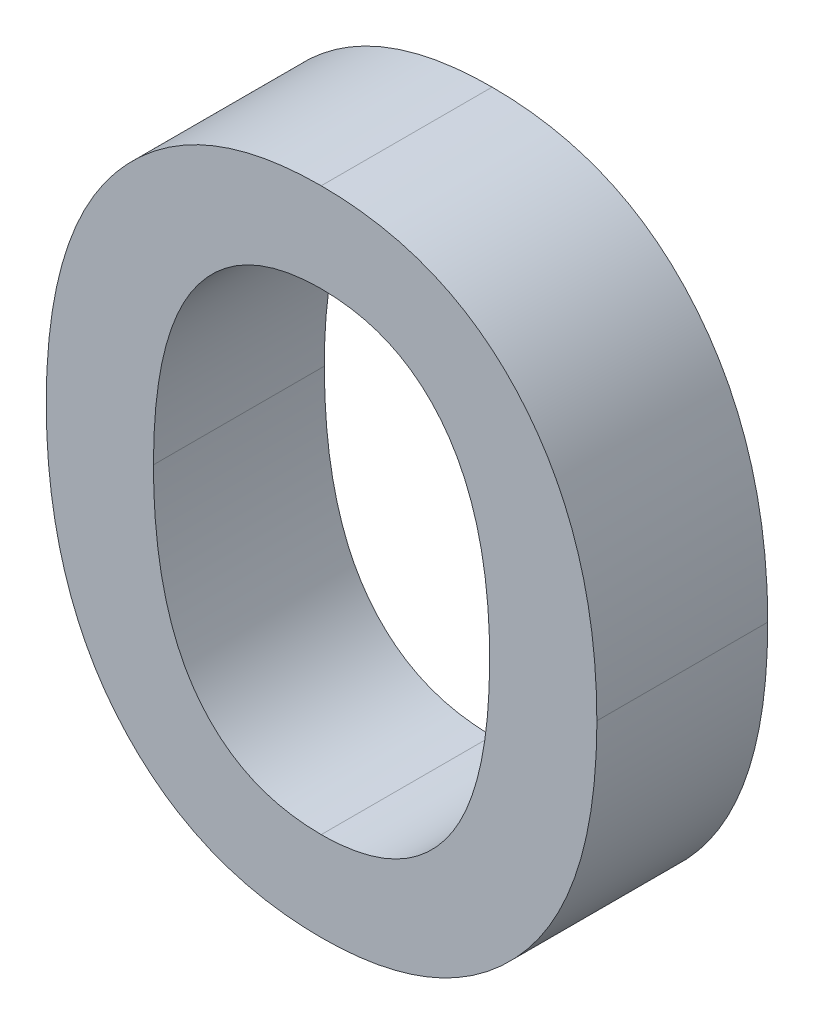
ISO-10303-21;
HEADER;
FILE_DESCRIPTION(('STEP AP214'),'2;1');
FILE_NAME('part.step','',(''),(''),'','','');
FILE_SCHEMA(('AUTOMOTIVE_DESIGN { 1 0 10303 214 1 1 1 1 }'));
ENDSEC;
DATA;
#1=APPLICATION_CONTEXT('core data for automotive mechanical design processes');
#2=APPLICATION_PROTOCOL_DEFINITION('international standard','automotive_design',2000,#1);
#3=PRODUCT_CONTEXT('',#1,'mechanical');
#4=PRODUCT('Part','Part','',(#3));
#5=PRODUCT_RELATED_PRODUCT_CATEGORY('part','',(#4));
#6=PRODUCT_DEFINITION_FORMATION('','',#4);
#7=PRODUCT_DEFINITION_CONTEXT('part definition',#1,'design');
#8=PRODUCT_DEFINITION('design','',#6,#7);
#9=PRODUCT_DEFINITION_SHAPE('','',#8);
#10=(LENGTH_UNIT() NAMED_UNIT(*) SI_UNIT(.MILLI.,.METRE.));
#11=(NAMED_UNIT(*) PLANE_ANGLE_UNIT() SI_UNIT($,.RADIAN.));
#12=(NAMED_UNIT(*) SI_UNIT($,.STERADIAN.) SOLID_ANGLE_UNIT());
#13=UNCERTAINTY_MEASURE_WITH_UNIT(LENGTH_MEASURE(1.E-05),#10,'distance_accuracy_value','');
#14=(GEOMETRIC_REPRESENTATION_CONTEXT(3) GLOBAL_UNCERTAINTY_ASSIGNED_CONTEXT((#13)) GLOBAL_UNIT_ASSIGNED_CONTEXT((#10,
#11,#12)) REPRESENTATION_CONTEXT('',''));
#15=CARTESIAN_POINT('',(0.,0.,0.));
#16=DIRECTION('',(0.,0.,1.));
#17=DIRECTION('',(1.,0.,0.));
#18=AXIS2_PLACEMENT_3D('',#15,#16,#17);
#19=CARTESIAN_POINT('',(-9.335563009929,-7.54897302523,0.));
#20=CARTESIAN_POINT('',(-9.335563009929,-7.54897302523,0.1));
#21=CARTESIAN_POINT('',(-9.38231139894,-7.54897302523,0.));
#22=CARTESIAN_POINT('',(-9.38231139894,-7.54897302523,0.1));
#23=CARTESIAN_POINT('',(-9.433734626853,-7.617926899021,0.));
#24=CARTESIAN_POINT('',(-9.433734626853,-7.617926899021,0.1));
#25=CARTESIAN_POINT('',(-9.433734626853,-7.687270342722,0.));
#26=CARTESIAN_POINT('',(-9.433734626853,-7.687270342722,0.1));
#27=B_SPLINE_SURFACE_WITH_KNOTS('',2,1,((#19,#20),(#21,#22),(#23,#24),(#25,#26)),.UNSPECIFIED.,
.F.,.F.,.F.,(3,1,3),(2,2),(0.,1.,2.),(0.,0.01),.UNSPECIFIED.);
#28=CARTESIAN_POINT('',(-9.335563009929,-7.54897302523,0.));
#29=CARTESIAN_POINT('',(-9.38231139894,-7.54897302523,0.));
#30=CARTESIAN_POINT('',(-9.433734626853,-7.617926899021,0.));
#31=CARTESIAN_POINT('',(-9.433734626853,-7.687270342722,0.));
#32=B_SPLINE_CURVE_WITH_KNOTS('',2,(#28,#29,#30,#31),.UNSPECIFIED.,.F.,.F.,(3,1,3),(0.,1.,2.),.UNSPECIFIED.);
#33=CARTESIAN_POINT('',(-9.335563009929,-7.54897302523,0.));
#34=VERTEX_POINT('',#33);
#35=CARTESIAN_POINT('',(-9.433734626853,-7.687270342722,0.));
#36=VERTEX_POINT('',#35);
#37=EDGE_CURVE('E11',#34,#36,#32,.T.);
#38=DIRECTION('',(0.,0.,1.));
#39=VECTOR('',#38,1.);
#40=CARTESIAN_POINT('',(-9.335563009929,-7.54897302523,0.));
#41=LINE('',#40,#39);
#42=CARTESIAN_POINT('',(-9.335563009929,-7.54897302523,0.1));
#43=VERTEX_POINT('',#42);
#44=EDGE_CURVE('E28',#34,#43,#41,.T.);
#45=CARTESIAN_POINT('',(-9.433734626853,-7.687270342722,0.1));
#46=CARTESIAN_POINT('',(-9.433734626853,-7.617926899021,0.1));
#47=CARTESIAN_POINT('',(-9.38231139894,-7.54897302523,0.1));
#48=CARTESIAN_POINT('',(-9.335563009929,-7.54897302523,0.1));
#49=B_SPLINE_CURVE_WITH_KNOTS('',2,(#45,#46,#47,#48),.UNSPECIFIED.,.F.,.F.,(3,1,3),(-2.,-1.,0.),.UNSPECIFIED.);
#50=CARTESIAN_POINT('',(-9.433734626853,-7.687270342722,0.1));
#51=VERTEX_POINT('',#50);
#52=EDGE_CURVE('E221',#51,#43,#49,.T.);
#53=DIRECTION('',(0.,0.,1.));
#54=VECTOR('',#53,1.);
#55=CARTESIAN_POINT('',(-9.433734626853,-7.687270342722,0.));
#56=LINE('',#55,#54);
#57=EDGE_CURVE('E41',#36,#51,#56,.T.);
#58=ORIENTED_EDGE('',*,*,#37,.F.);
#59=ORIENTED_EDGE('',*,*,#44,.T.);
#60=ORIENTED_EDGE('',*,*,#52,.F.);
#61=ORIENTED_EDGE('',*,*,#57,.F.);
#62=EDGE_LOOP('',(#58,#59,#60,#61));
#63=FACE_BOUND('',#62,.T.);
#64=ADVANCED_FACE('F17',(#63),#27,.F.);
#65=CARTESIAN_POINT('',(-9.237001823097,-7.687270342722,0.));
#66=CARTESIAN_POINT('',(-9.237001823097,-7.687270342722,0.1));
#67=CARTESIAN_POINT('',(-9.237001823097,-7.619095608747,0.));
#68=CARTESIAN_POINT('',(-9.237001823097,-7.619095608747,0.1));
#69=CARTESIAN_POINT('',(-9.288425051009,-7.54897302523,0.));
#70=CARTESIAN_POINT('',(-9.288425051009,-7.54897302523,0.1));
#71=CARTESIAN_POINT('',(-9.335563009929,-7.54897302523,0.));
#72=CARTESIAN_POINT('',(-9.335563009929,-7.54897302523,0.1));
#73=B_SPLINE_SURFACE_WITH_KNOTS('',2,1,((#65,#66),(#67,#68),(#69,#70),(#71,#72)),.UNSPECIFIED.,
.F.,.F.,.F.,(3,1,3),(2,2),(0.,1.,2.),(0.,0.01),.UNSPECIFIED.);
#74=CARTESIAN_POINT('',(-9.237001823097,-7.687270342722,0.));
#75=CARTESIAN_POINT('',(-9.237001823097,-7.619095608747,0.));
#76=CARTESIAN_POINT('',(-9.288425051009,-7.54897302523,0.));
#77=CARTESIAN_POINT('',(-9.335563009929,-7.54897302523,0.));
#78=B_SPLINE_CURVE_WITH_KNOTS('',2,(#74,#75,#76,#77),.UNSPECIFIED.,.F.,.F.,(3,1,3),(0.,1.,2.),.UNSPECIFIED.);
#79=CARTESIAN_POINT('',(-9.237001823097,-7.687270342722,0.));
#80=VERTEX_POINT('',#79);
#81=EDGE_CURVE('E212',#80,#34,#78,.T.);
#82=DIRECTION('',(0.,0.,1.));
#83=VECTOR('',#82,1.);
#84=CARTESIAN_POINT('',(-9.237001823097,-7.687270342722,0.));
#85=LINE('',#84,#83);
#86=CARTESIAN_POINT('',(-9.237001823097,-7.687270342722,0.1));
#87=VERTEX_POINT('',#86);
#88=EDGE_CURVE('E206',#80,#87,#85,.T.);
#89=CARTESIAN_POINT('',(-9.335563009929,-7.54897302523,0.1));
#90=CARTESIAN_POINT('',(-9.288425051009,-7.54897302523,0.1));
#91=CARTESIAN_POINT('',(-9.237001823097,-7.619095608747,0.1));
#92=CARTESIAN_POINT('',(-9.237001823097,-7.687270342722,0.1));
#93=B_SPLINE_CURVE_WITH_KNOTS('',2,(#89,#90,#91,#92),.UNSPECIFIED.,.F.,.F.,(3,1,3),(-2.,-1.,0.),.UNSPECIFIED.);
#94=EDGE_CURVE('E199',#43,#87,#93,.T.);
#95=ORIENTED_EDGE('',*,*,#81,.F.);
#96=ORIENTED_EDGE('',*,*,#88,.T.);
#97=ORIENTED_EDGE('',*,*,#94,.F.);
#98=ORIENTED_EDGE('',*,*,#44,.F.);
#99=EDGE_LOOP('',(#95,#96,#97,#98));
#100=FACE_BOUND('',#99,.T.);
#101=ADVANCED_FACE('F227',(#100),#73,.F.);
#102=CARTESIAN_POINT('',(-9.335563009929,-7.825567660214,0.));
#103=CARTESIAN_POINT('',(-9.335563009929,-7.825567660214,0.1));
#104=CARTESIAN_POINT('',(-9.288425051009,-7.825567660214,0.));
#105=CARTESIAN_POINT('',(-9.288425051009,-7.825567660214,0.1));
#106=CARTESIAN_POINT('',(-9.237001823097,-7.757392926239,0.));
#107=CARTESIAN_POINT('',(-9.237001823097,-7.757392926239,0.1));
#108=CARTESIAN_POINT('',(-9.237001823097,-7.687270342722,0.));
#109=CARTESIAN_POINT('',(-9.237001823097,-7.687270342722,0.1));
#110=B_SPLINE_SURFACE_WITH_KNOTS('',2,1,((#102,#103),(#104,#105),(#106,#107),(#108,#109)),
.UNSPECIFIED.,.F.,.F.,.F.,(3,1,3),(2,2),(0.,1.,2.),(0.,0.01),.UNSPECIFIED.);
#111=CARTESIAN_POINT('',(-9.335563009929,-7.825567660214,0.));
#112=CARTESIAN_POINT('',(-9.288425051009,-7.825567660214,0.));
#113=CARTESIAN_POINT('',(-9.237001823097,-7.757392926239,0.));
#114=CARTESIAN_POINT('',(-9.237001823097,-7.687270342722,0.));
#115=B_SPLINE_CURVE_WITH_KNOTS('',2,(#111,#112,#113,#114),.UNSPECIFIED.,.F.,.F.,(3,1,3),(0.,1.,
2.),.UNSPECIFIED.);
#116=CARTESIAN_POINT('',(-9.335563009929,-7.825567660214,0.));
#117=VERTEX_POINT('',#116);
#118=EDGE_CURVE('E194',#117,#80,#115,.T.);
#119=DIRECTION('',(0.,0.,1.));
#120=VECTOR('',#119,1.);
#121=CARTESIAN_POINT('',(-9.335563009929,-7.825567660214,0.));
#122=LINE('',#121,#120);
#123=CARTESIAN_POINT('',(-9.335563009929,-7.825567660214,0.1));
#124=VERTEX_POINT('',#123);
#125=EDGE_CURVE('E188',#117,#124,#122,.T.);
#126=CARTESIAN_POINT('',(-9.237001823097,-7.687270342722,0.1));
#127=CARTESIAN_POINT('',(-9.237001823097,-7.757392926239,0.1));
#128=CARTESIAN_POINT('',(-9.288425051009,-7.825567660214,0.1));
#129=CARTESIAN_POINT('',(-9.335563009929,-7.825567660214,0.1));
#130=B_SPLINE_CURVE_WITH_KNOTS('',2,(#126,#127,#128,#129),.UNSPECIFIED.,.F.,.F.,(3,1,3),(-2.,
-1.,0.),.UNSPECIFIED.);
#131=EDGE_CURVE('E181',#87,#124,#130,.T.);
#132=ORIENTED_EDGE('',*,*,#118,.F.);
#133=ORIENTED_EDGE('',*,*,#125,.T.);
#134=ORIENTED_EDGE('',*,*,#131,.F.);
#135=ORIENTED_EDGE('',*,*,#88,.F.);
#136=EDGE_LOOP('',(#132,#133,#134,#135));
#137=FACE_BOUND('',#136,.T.);
#138=ADVANCED_FACE('F237',(#137),#110,.F.);
#139=CARTESIAN_POINT('',(-9.433734626853,-7.687270342722,0.));
#140=CARTESIAN_POINT('',(-9.433734626853,-7.687270342722,0.1));
#141=CARTESIAN_POINT('',(-9.433734626853,-7.757392926239,0.));
#142=CARTESIAN_POINT('',(-9.433734626853,-7.757392926239,0.1));
#143=CARTESIAN_POINT('',(-9.382700968849,-7.825567660214,0.));
#144=CARTESIAN_POINT('',(-9.382700968849,-7.825567660214,0.1));
#145=CARTESIAN_POINT('',(-9.335563009929,-7.825567660214,0.));
#146=CARTESIAN_POINT('',(-9.335563009929,-7.825567660214,0.1));
#147=B_SPLINE_SURFACE_WITH_KNOTS('',2,1,((#139,#140),(#141,#142),(#143,#144),(#145,#146)),
.UNSPECIFIED.,.F.,.F.,.F.,(3,1,3),(2,2),(0.,1.,2.),(0.,0.01),.UNSPECIFIED.);
#148=CARTESIAN_POINT('',(-9.433734626853,-7.687270342722,0.));
#149=CARTESIAN_POINT('',(-9.433734626853,-7.757392926239,0.));
#150=CARTESIAN_POINT('',(-9.382700968849,-7.825567660214,0.));
#151=CARTESIAN_POINT('',(-9.335563009929,-7.825567660214,0.));
#152=B_SPLINE_CURVE_WITH_KNOTS('',2,(#148,#149,#150,#151),.UNSPECIFIED.,.F.,.F.,(3,1,3),(0.,1.,
2.),.UNSPECIFIED.);
#153=EDGE_CURVE('E173',#36,#117,#152,.T.);
#154=CARTESIAN_POINT('',(-9.335563009929,-7.825567660214,0.1));
#155=CARTESIAN_POINT('',(-9.382700968849,-7.825567660214,0.1));
#156=CARTESIAN_POINT('',(-9.433734626853,-7.757392926239,0.1));
#157=CARTESIAN_POINT('',(-9.433734626853,-7.687270342722,0.1));
#158=B_SPLINE_CURVE_WITH_KNOTS('',2,(#154,#155,#156,#157),.UNSPECIFIED.,.F.,.F.,(3,1,3),(-2.,
-1.,0.),.UNSPECIFIED.);
#159=EDGE_CURVE('E165',#124,#51,#158,.T.);
#160=ORIENTED_EDGE('',*,*,#153,.F.);
#161=ORIENTED_EDGE('',*,*,#57,.T.);
#162=ORIENTED_EDGE('',*,*,#159,.F.);
#163=ORIENTED_EDGE('',*,*,#125,.F.);
#164=EDGE_LOOP('',(#160,#161,#162,#163));
#165=FACE_BOUND('',#164,.T.);
#166=ADVANCED_FACE('F232',(#165),#147,.F.);
#167=CARTESIAN_POINT('',(-9.174281067839,-7.687270342722,0.));
#168=CARTESIAN_POINT('',(-9.174281067839,-7.687270342722,0.1));
#169=CARTESIAN_POINT('',(-9.174281067839,-7.599227543417,0.));
#170=CARTESIAN_POINT('',(-9.174281067839,-7.599227543417,0.1));
#171=CARTESIAN_POINT('',(-9.260376017602,-7.4967706575,0.));
#172=CARTESIAN_POINT('',(-9.260376017602,-7.4967706575,0.1));
#173=CARTESIAN_POINT('',(-9.335563009929,-7.4967706575,0.));
#174=CARTESIAN_POINT('',(-9.335563009929,-7.4967706575,0.1));
#175=B_SPLINE_SURFACE_WITH_KNOTS('',2,1,((#167,#168),(#169,#170),(#171,#172),(#173,#174)),
.UNSPECIFIED.,.F.,.F.,.F.,(3,1,3),(2,2),(-2.,-1.,0.),(0.,0.01),.UNSPECIFIED.);
#176=CARTESIAN_POINT('',(-9.335563009929,-7.4967706575,0.));
#177=CARTESIAN_POINT('',(-9.260376017602,-7.4967706575,0.));
#178=CARTESIAN_POINT('',(-9.174281067839,-7.599227543417,0.));
#179=CARTESIAN_POINT('',(-9.174281067839,-7.687270342722,0.));
#180=B_SPLINE_CURVE_WITH_KNOTS('',2,(#176,#177,#178,#179),.UNSPECIFIED.,.F.,.F.,(3,1,3),(0.,1.,
2.),.UNSPECIFIED.);
#181=CARTESIAN_POINT('',(-9.335563009929,-7.4967706575,0.));
#182=VERTEX_POINT('',#181);
#183=CARTESIAN_POINT('',(-9.174281067839,-7.687270342722,0.));
#184=VERTEX_POINT('',#183);
#185=EDGE_CURVE('E161',#182,#184,#180,.T.);
#186=DIRECTION('',(0.,0.,1.));
#187=VECTOR('',#186,1.);
#188=CARTESIAN_POINT('',(-9.335563009929,-7.4967706575,0.));
#189=LINE('',#188,#187);
#190=CARTESIAN_POINT('',(-9.335563009929,-7.4967706575,0.1));
#191=VERTEX_POINT('',#190);
#192=EDGE_CURVE('E156',#182,#191,#189,.T.);
#193=CARTESIAN_POINT('',(-9.174281067839,-7.687270342722,0.1));
#194=CARTESIAN_POINT('',(-9.174281067839,-7.599227543417,0.1));
#195=CARTESIAN_POINT('',(-9.260376017602,-7.4967706575,0.1));
#196=CARTESIAN_POINT('',(-9.335563009929,-7.4967706575,0.1));
#197=B_SPLINE_CURVE_WITH_KNOTS('',2,(#193,#194,#195,#196),.UNSPECIFIED.,.F.,.F.,(3,1,3),(-2.,
-1.,0.),.UNSPECIFIED.);
#198=CARTESIAN_POINT('',(-9.174281067839,-7.687270342722,0.1));
#199=VERTEX_POINT('',#198);
#200=EDGE_CURVE('E110',#199,#191,#197,.T.);
#201=DIRECTION('',(0.,0.,1.));
#202=VECTOR('',#201,1.);
#203=CARTESIAN_POINT('',(-9.174281067839,-7.687270342722,0.));
#204=LINE('',#203,#202);
#205=EDGE_CURVE('E147',#184,#199,#204,.T.);
#206=ORIENTED_EDGE('',*,*,#185,.F.);
#207=ORIENTED_EDGE('',*,*,#192,.T.);
#208=ORIENTED_EDGE('',*,*,#200,.F.);
#209=ORIENTED_EDGE('',*,*,#205,.F.);
#210=EDGE_LOOP('',(#206,#207,#208,#209));
#211=FACE_BOUND('',#210,.T.);
#212=ADVANCED_FACE('F245',(#211),#175,.T.);
#213=CARTESIAN_POINT('',(-9.335563009929,-7.877770027944,0.));
#214=CARTESIAN_POINT('',(-9.335563009929,-7.877770027944,0.1));
#215=CARTESIAN_POINT('',(-9.263103006961,-7.877770027944,0.));
#216=CARTESIAN_POINT('',(-9.263103006961,-7.877770027944,0.1));
#217=CARTESIAN_POINT('',(-9.174281067839,-7.777650561477,0.));
#218=CARTESIAN_POINT('',(-9.174281067839,-7.777650561477,0.1));
#219=CARTESIAN_POINT('',(-9.174281067839,-7.687270342722,0.));
#220=CARTESIAN_POINT('',(-9.174281067839,-7.687270342722,0.1));
#221=B_SPLINE_SURFACE_WITH_KNOTS('',2,1,((#213,#214),(#215,#216),(#217,#218),(#219,#220)),
.UNSPECIFIED.,.F.,.F.,.F.,(3,1,3),(2,2),(-2.,-1.,0.),(0.,0.01),.UNSPECIFIED.);
#222=CARTESIAN_POINT('',(-9.174281067839,-7.687270342722,0.));
#223=CARTESIAN_POINT('',(-9.174281067839,-7.777650561477,0.));
#224=CARTESIAN_POINT('',(-9.263103006961,-7.877770027944,0.));
#225=CARTESIAN_POINT('',(-9.335563009929,-7.877770027944,0.));
#226=B_SPLINE_CURVE_WITH_KNOTS('',2,(#222,#223,#224,#225),.UNSPECIFIED.,.F.,.F.,(3,1,3),(0.,1.,
2.),.UNSPECIFIED.);
#227=CARTESIAN_POINT('',(-9.335563009929,-7.877770027944,0.));
#228=VERTEX_POINT('',#227);
#229=EDGE_CURVE('E140',#184,#228,#226,.T.);
#230=CARTESIAN_POINT('',(-9.335563009929,-7.877770027944,0.1));
#231=CARTESIAN_POINT('',(-9.263103006961,-7.877770027944,0.1));
#232=CARTESIAN_POINT('',(-9.174281067839,-7.777650561477,0.1));
#233=CARTESIAN_POINT('',(-9.174281067839,-7.687270342722,0.1));
#234=B_SPLINE_CURVE_WITH_KNOTS('',2,(#230,#231,#232,#233),.UNSPECIFIED.,.F.,.F.,(3,1,3),(-2.,
-1.,0.),.UNSPECIFIED.);
#235=CARTESIAN_POINT('',(-9.335563009929,-7.877770027944,0.1));
#236=VERTEX_POINT('',#235);
#237=EDGE_CURVE('E136',#236,#199,#234,.T.);
#238=DIRECTION('',(0.,0.,1.));
#239=VECTOR('',#238,1.);
#240=CARTESIAN_POINT('',(-9.335563009929,-7.877770027944,0.));
#241=LINE('',#240,#239);
#242=EDGE_CURVE('E93',#228,#236,#241,.T.);
#243=ORIENTED_EDGE('',*,*,#229,.F.);
#244=ORIENTED_EDGE('',*,*,#205,.T.);
#245=ORIENTED_EDGE('',*,*,#237,.F.);
#246=ORIENTED_EDGE('',*,*,#242,.F.);
#247=EDGE_LOOP('',(#243,#244,#245,#246));
#248=FACE_BOUND('',#247,.T.);
#249=ADVANCED_FACE('F283',(#248),#221,.T.);
#250=CARTESIAN_POINT('',(-9.49645538211,-7.687270342722,0.));
#251=CARTESIAN_POINT('',(-9.49645538211,-7.687270342722,0.1));
#252=CARTESIAN_POINT('',(-9.49645538211,-7.778040131386,0.));
#253=CARTESIAN_POINT('',(-9.49645538211,-7.778040131386,0.1));
#254=CARTESIAN_POINT('',(-9.408802152714,-7.877770027944,0.));
#255=CARTESIAN_POINT('',(-9.408802152714,-7.877770027944,0.1));
#256=CARTESIAN_POINT('',(-9.335563009929,-7.877770027944,0.));
#257=CARTESIAN_POINT('',(-9.335563009929,-7.877770027944,0.1));
#258=B_SPLINE_SURFACE_WITH_KNOTS('',2,1,((#250,#251),(#252,#253),(#254,#255),(#256,#257)),
.UNSPECIFIED.,.F.,.F.,.F.,(3,1,3),(2,2),(-2.,-1.,0.),(0.,0.01),.UNSPECIFIED.);
#259=CARTESIAN_POINT('',(-9.335563009929,-7.877770027944,0.));
#260=CARTESIAN_POINT('',(-9.408802152714,-7.877770027944,0.));
#261=CARTESIAN_POINT('',(-9.49645538211,-7.778040131386,0.));
#262=CARTESIAN_POINT('',(-9.49645538211,-7.687270342722,0.));
#263=B_SPLINE_CURVE_WITH_KNOTS('',2,(#259,#260,#261,#262),.UNSPECIFIED.,.F.,.F.,(3,1,3),(0.,1.,
2.),.UNSPECIFIED.);
#264=CARTESIAN_POINT('',(-9.49645538211,-7.687270342722,0.));
#265=VERTEX_POINT('',#264);
#266=EDGE_CURVE('E97',#228,#265,#263,.T.);
#267=CARTESIAN_POINT('',(-9.49645538211,-7.687270342722,0.1));
#268=CARTESIAN_POINT('',(-9.49645538211,-7.778040131386,0.1));
#269=CARTESIAN_POINT('',(-9.408802152714,-7.877770027944,0.1));
#270=CARTESIAN_POINT('',(-9.335563009929,-7.877770027944,0.1));
#271=B_SPLINE_CURVE_WITH_KNOTS('',2,(#267,#268,#269,#270),.UNSPECIFIED.,.F.,.F.,(3,1,3),(-2.,
-1.,0.),.UNSPECIFIED.);
#272=CARTESIAN_POINT('',(-9.49645538211,-7.687270342722,0.1));
#273=VERTEX_POINT('',#272);
#274=EDGE_CURVE('E86',#273,#236,#271,.T.);
#275=DIRECTION('',(0.,0.,1.));
#276=VECTOR('',#275,1.);
#277=CARTESIAN_POINT('',(-9.49645538211,-7.687270342722,0.));
#278=LINE('',#277,#276);
#279=EDGE_CURVE('E90',#265,#273,#278,.T.);
#280=ORIENTED_EDGE('',*,*,#266,.F.);
#281=ORIENTED_EDGE('',*,*,#242,.T.);
#282=ORIENTED_EDGE('',*,*,#274,.F.);
#283=ORIENTED_EDGE('',*,*,#279,.F.);
#284=EDGE_LOOP('',(#280,#281,#282,#283));
#285=FACE_BOUND('',#284,.T.);
#286=ADVANCED_FACE('F89',(#285),#258,.T.);
#287=CARTESIAN_POINT('',(-9.335563009929,-7.4967706575,0.));
#288=CARTESIAN_POINT('',(-9.335563009929,-7.4967706575,0.1));
#289=CARTESIAN_POINT('',(-9.408802152714,-7.4967706575,0.));
#290=CARTESIAN_POINT('',(-9.408802152714,-7.4967706575,0.1));
#291=CARTESIAN_POINT('',(-9.49645538211,-7.596110984149,0.));
#292=CARTESIAN_POINT('',(-9.49645538211,-7.596110984149,0.1));
#293=CARTESIAN_POINT('',(-9.49645538211,-7.687270342722,0.));
#294=CARTESIAN_POINT('',(-9.49645538211,-7.687270342722,0.1));
#295=B_SPLINE_SURFACE_WITH_KNOTS('',2,1,((#287,#288),(#289,#290),(#291,#292),(#293,#294)),
.UNSPECIFIED.,.F.,.F.,.F.,(3,1,3),(2,2),(-2.,-1.,0.),(0.,0.01),.UNSPECIFIED.);
#296=CARTESIAN_POINT('',(-9.49645538211,-7.687270342722,0.));
#297=CARTESIAN_POINT('',(-9.49645538211,-7.596110984149,0.));
#298=CARTESIAN_POINT('',(-9.408802152714,-7.4967706575,0.));
#299=CARTESIAN_POINT('',(-9.335563009929,-7.4967706575,0.));
#300=B_SPLINE_CURVE_WITH_KNOTS('',2,(#296,#297,#298,#299),.UNSPECIFIED.,.F.,.F.,(3,1,3),(0.,1.,
2.),.UNSPECIFIED.);
#301=EDGE_CURVE('E105',#265,#182,#300,.T.);
#302=CARTESIAN_POINT('',(-9.335563009929,-7.4967706575,0.1));
#303=CARTESIAN_POINT('',(-9.408802152714,-7.4967706575,0.1));
#304=CARTESIAN_POINT('',(-9.49645538211,-7.596110984149,0.1));
#305=CARTESIAN_POINT('',(-9.49645538211,-7.687270342722,0.1));
#306=B_SPLINE_CURVE_WITH_KNOTS('',2,(#302,#303,#304,#305),.UNSPECIFIED.,.F.,.F.,(3,1,3),(-2.,
-1.,0.),.UNSPECIFIED.);
#307=EDGE_CURVE('E103',#191,#273,#306,.T.);
#308=ORIENTED_EDGE('',*,*,#301,.F.);
#309=ORIENTED_EDGE('',*,*,#279,.T.);
#310=ORIENTED_EDGE('',*,*,#307,.F.);
#311=ORIENTED_EDGE('',*,*,#192,.F.);
#312=EDGE_LOOP('',(#308,#309,#310,#311));
#313=FACE_BOUND('',#312,.T.);
#314=ADVANCED_FACE('F101',(#313),#295,.T.);
#315=CARTESIAN_POINT('',(-9.33554283814,-7.687178582046,0.));
#316=DIRECTION('',(0.,0.,1.));
#317=DIRECTION('',(1.,0.,0.));
#318=AXIS2_PLACEMENT_3D('',#315,#316,#317);
#319=PLANE('',#318);
#320=ORIENTED_EDGE('',*,*,#301,.T.);
#321=ORIENTED_EDGE('',*,*,#185,.T.);
#322=ORIENTED_EDGE('',*,*,#229,.T.);
#323=ORIENTED_EDGE('',*,*,#266,.T.);
#324=EDGE_LOOP('',(#320,#321,#322,#323));
#325=FACE_BOUND('',#324,.T.);
#326=ORIENTED_EDGE('',*,*,#37,.T.);
#327=ORIENTED_EDGE('',*,*,#153,.T.);
#328=ORIENTED_EDGE('',*,*,#118,.T.);
#329=ORIENTED_EDGE('',*,*,#81,.T.);
#330=EDGE_LOOP('',(#326,#327,#328,#329));
#331=FACE_BOUND('',#330,.T.);
#332=ADVANCED_FACE('F235',(#325,#331),#319,.F.);
#333=CARTESIAN_POINT('',(-9.33554283814,-7.687178582046,0.1));
#334=DIRECTION('',(0.,0.,1.));
#335=DIRECTION('',(1.,0.,0.));
#336=AXIS2_PLACEMENT_3D('',#333,#334,#335);
#337=PLANE('',#336);
#338=ORIENTED_EDGE('',*,*,#307,.T.);
#339=ORIENTED_EDGE('',*,*,#274,.T.);
#340=ORIENTED_EDGE('',*,*,#237,.T.);
#341=ORIENTED_EDGE('',*,*,#200,.T.);
#342=EDGE_LOOP('',(#338,#339,#340,#341));
#343=FACE_BOUND('',#342,.T.);
#344=ORIENTED_EDGE('',*,*,#52,.T.);
#345=ORIENTED_EDGE('',*,*,#94,.T.);
#346=ORIENTED_EDGE('',*,*,#131,.T.);
#347=ORIENTED_EDGE('',*,*,#159,.T.);
#348=EDGE_LOOP('',(#344,#345,#346,#347));
#349=FACE_BOUND('',#348,.T.);
#350=ADVANCED_FACE('F108',(#343,#349),#337,.T.);
#351=CLOSED_SHELL('',(#64,#101,#138,#166,#212,#249,#286,#314,#332,#350));
#352=MANIFOLD_SOLID_BREP('B1',#351);
#353=ADVANCED_BREP_SHAPE_REPRESENTATION('',(#18,#352),#14);
#354=SHAPE_DEFINITION_REPRESENTATION(#9,#353);
ENDSEC;
END-ISO-10303-21;
